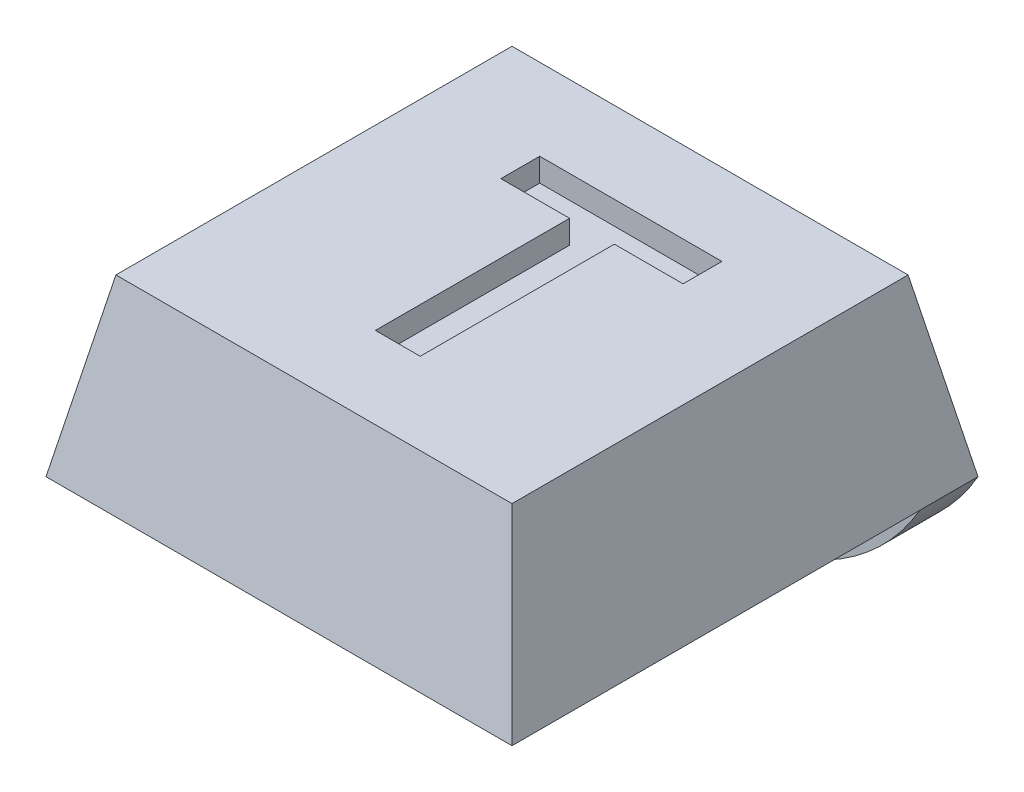
ISO-10303-21;
HEADER;
FILE_DESCRIPTION(('STEP AP214'),'2;1');
FILE_NAME('part.step','',(''),(''),'','','');
FILE_SCHEMA(('AUTOMOTIVE_DESIGN { 1 0 10303 214 1 1 1 1 }'));
ENDSEC;
DATA;
#1=APPLICATION_CONTEXT('core data for automotive mechanical design processes');
#2=APPLICATION_PROTOCOL_DEFINITION('international standard','automotive_design',2000,#1);
#3=PRODUCT_CONTEXT('',#1,'mechanical');
#4=PRODUCT('Part','Part','',(#3));
#5=PRODUCT_RELATED_PRODUCT_CATEGORY('part','',(#4));
#6=PRODUCT_DEFINITION_FORMATION('','',#4);
#7=PRODUCT_DEFINITION_CONTEXT('part definition',#1,'design');
#8=PRODUCT_DEFINITION('design','',#6,#7);
#9=PRODUCT_DEFINITION_SHAPE('','',#8);
#10=(LENGTH_UNIT() NAMED_UNIT(*) SI_UNIT(.MILLI.,.METRE.));
#11=(NAMED_UNIT(*) PLANE_ANGLE_UNIT() SI_UNIT($,.RADIAN.));
#12=(NAMED_UNIT(*) SI_UNIT($,.STERADIAN.) SOLID_ANGLE_UNIT());
#13=UNCERTAINTY_MEASURE_WITH_UNIT(LENGTH_MEASURE(1.E-05),#10,'distance_accuracy_value','');
#14=(GEOMETRIC_REPRESENTATION_CONTEXT(3) GLOBAL_UNCERTAINTY_ASSIGNED_CONTEXT((#13)) GLOBAL_UNIT_ASSIGNED_CONTEXT((#10,
#11,#12)) REPRESENTATION_CONTEXT('',''));
#15=CARTESIAN_POINT('',(0.,0.,0.));
#16=DIRECTION('',(0.,0.,1.));
#17=DIRECTION('',(1.,0.,0.));
#18=AXIS2_PLACEMENT_3D('',#15,#16,#17);
#19=CARTESIAN_POINT('',(0.,3.,0.));
#20=DIRECTION('',(0.,-1.,0.));
#21=DIRECTION('',(0.,0.,-1.));
#22=AXIS2_PLACEMENT_3D('',#19,#20,#21);
#23=PLANE('',#22);
#24=DIRECTION('',(-1.,0.,0.));
#25=VECTOR('',#24,1.);
#26=CARTESIAN_POINT('',(11.,3.,-0.6));
#27=LINE('',#26,#25);
#28=CARTESIAN_POINT('',(7.4,3.,-0.6));
#29=VERTEX_POINT('',#28);
#30=CARTESIAN_POINT('',(0.6,3.,-0.6));
#31=VERTEX_POINT('',#30);
#32=EDGE_CURVE('E205',#29,#31,#27,.T.);
#33=ORIENTED_EDGE('',*,*,#32,.F.);
#34=DIRECTION('',(0.,0.,1.));
#35=VECTOR('',#34,1.);
#36=CARTESIAN_POINT('',(7.4,3.,-8.));
#37=LINE('',#36,#35);
#38=CARTESIAN_POINT('',(7.4,3.,-7.4));
#39=VERTEX_POINT('',#38);
#40=EDGE_CURVE('E218',#39,#29,#37,.T.);
#41=ORIENTED_EDGE('',*,*,#40,.F.);
#42=DIRECTION('',(-1.,0.,0.));
#43=VECTOR('',#42,1.);
#44=CARTESIAN_POINT('',(11.,3.,-7.4));
#45=LINE('',#44,#43);
#46=CARTESIAN_POINT('',(0.599999999999999,3.,-7.4));
#47=VERTEX_POINT('',#46);
#48=EDGE_CURVE('E201',#39,#47,#45,.T.);
#49=ORIENTED_EDGE('',*,*,#48,.T.);
#50=DIRECTION('',(0.,0.,1.));
#51=VECTOR('',#50,1.);
#52=CARTESIAN_POINT('',(0.6,3.,-8.));
#53=LINE('',#52,#51);
#54=EDGE_CURVE('E221',#47,#31,#53,.T.);
#55=ORIENTED_EDGE('',*,*,#54,.T.);
#56=EDGE_LOOP('',(#33,#41,#49,#55));
#57=FACE_BOUND('',#56,.T.);
#58=DIRECTION('',(-1.,0.,0.));
#59=VECTOR('',#58,1.);
#60=CARTESIAN_POINT('',(4.42159375367961,3.,-2.00285635155468));
#61=LINE('',#60,#59);
#62=CARTESIAN_POINT('',(4.42159375367961,3.,-2.00285635155468));
#63=VERTEX_POINT('',#62);
#64=CARTESIAN_POINT('',(3.65236298444884,3.,-2.00285635155468));
#65=VERTEX_POINT('',#64);
#66=EDGE_CURVE('E58',#63,#65,#61,.T.);
#67=ORIENTED_EDGE('',*,*,#66,.T.);
#68=DIRECTION('',(0.,0.,-1.));
#69=VECTOR('',#68,1.);
#70=CARTESIAN_POINT('',(3.65236298444884,3.,-2.00285635155468));
#71=LINE('',#70,#69);
#72=CARTESIAN_POINT('',(3.65236298444884,3.,-5.33618968488802));
#73=VERTEX_POINT('',#72);
#74=EDGE_CURVE('E173',#65,#73,#71,.T.);
#75=ORIENTED_EDGE('',*,*,#74,.T.);
#76=DIRECTION('',(-1.,0.,0.));
#77=VECTOR('',#76,1.);
#78=CARTESIAN_POINT('',(3.65236298444884,3.,-5.33618968488802));
#79=LINE('',#78,#77);
#80=CARTESIAN_POINT('',(2.47287580496166,3.,-5.33618968488802));
#81=VERTEX_POINT('',#80);
#82=EDGE_CURVE('E582',#73,#81,#79,.T.);
#83=ORIENTED_EDGE('',*,*,#82,.T.);
#84=DIRECTION('',(0.,0.,-1.));
#85=VECTOR('',#84,1.);
#86=CARTESIAN_POINT('',(2.47287580496166,3.,-5.33618968488802));
#87=LINE('',#86,#85);
#88=CARTESIAN_POINT('',(2.47287580496166,3.,-6.00285635155468));
#89=VERTEX_POINT('',#88);
#90=EDGE_CURVE('E584',#81,#89,#87,.T.);
#91=ORIENTED_EDGE('',*,*,#90,.T.);
#92=DIRECTION('',(1.,0.,0.));
#93=VECTOR('',#92,1.);
#94=CARTESIAN_POINT('',(2.47287580496166,3.,-6.00285635155468));
#95=LINE('',#94,#93);
#96=CARTESIAN_POINT('',(5.60108093316679,3.,-6.00285635155468));
#97=VERTEX_POINT('',#96);
#98=EDGE_CURVE('E560',#89,#97,#95,.T.);
#99=ORIENTED_EDGE('',*,*,#98,.T.);
#100=DIRECTION('',(0.,0.,1.));
#101=VECTOR('',#100,1.);
#102=CARTESIAN_POINT('',(5.60108093316679,3.,-6.00285635155468));
#103=LINE('',#102,#101);
#104=CARTESIAN_POINT('',(5.60108093316679,3.,-5.33618968488802));
#105=VERTEX_POINT('',#104);
#106=EDGE_CURVE('E555',#97,#105,#103,.T.);
#107=ORIENTED_EDGE('',*,*,#106,.T.);
#108=DIRECTION('',(-1.,0.,0.));
#109=VECTOR('',#108,1.);
#110=CARTESIAN_POINT('',(5.60108093316679,3.,-5.33618968488802));
#111=LINE('',#110,#109);
#112=CARTESIAN_POINT('',(4.42159375367961,3.,-5.33618968488802));
#113=VERTEX_POINT('',#112);
#114=EDGE_CURVE('E549',#105,#113,#111,.T.);
#115=ORIENTED_EDGE('',*,*,#114,.T.);
#116=DIRECTION('',(0.,0.,1.));
#117=VECTOR('',#116,1.);
#118=CARTESIAN_POINT('',(4.42159375367961,3.,-5.33618968488802));
#119=LINE('',#118,#117);
#120=EDGE_CURVE('E169',#113,#63,#119,.T.);
#121=ORIENTED_EDGE('',*,*,#120,.T.);
#122=EDGE_LOOP('',(#67,#75,#83,#91,#99,#107,#115,#121));
#123=FACE_BOUND('',#122,.T.);
#124=ADVANCED_FACE('F42',(#57,#123),#23,.F.);
#125=CARTESIAN_POINT('',(8.,0.,-8.));
#126=DIRECTION('',(-0.98058067569092,-0.196116135138184,0.));
#127=DIRECTION('',(0.196116135138184,-0.98058067569092,0.));
#128=AXIS2_PLACEMENT_3D('',#125,#126,#127);
#129=PLANE('',#128);
#130=DIRECTION('',(-0.192450089729875,0.962250448649376,-0.192450089729875));
#131=VECTOR('',#130,1.);
#132=CARTESIAN_POINT('',(7.7037037037037,1.48148148148148,-0.296296296296296));
#133=LINE('',#132,#131);
#134=CARTESIAN_POINT('',(8.,0.,0.));
#135=VERTEX_POINT('',#134);
#136=EDGE_CURVE('E215',#135,#29,#133,.T.);
#137=ORIENTED_EDGE('',*,*,#136,.F.);
#138=DIRECTION('',(0.,0.,-1.));
#139=VECTOR('',#138,1.);
#140=CARTESIAN_POINT('',(8.,0.,0.));
#141=LINE('',#140,#139);
#142=CARTESIAN_POINT('',(8.,0.,-7.));
#143=VERTEX_POINT('',#142);
#144=EDGE_CURVE('E234',#135,#143,#141,.T.);
#145=ORIENTED_EDGE('',*,*,#144,.T.);
#146=DIRECTION('',(0.,0.,1.));
#147=VECTOR('',#146,1.);
#148=CARTESIAN_POINT('',(8.,0.,-8.));
#149=LINE('',#148,#147);
#150=CARTESIAN_POINT('',(8.,0.,-8.));
#151=VERTEX_POINT('',#150);
#152=EDGE_CURVE('E175',#151,#143,#149,.T.);
#153=ORIENTED_EDGE('',*,*,#152,.F.);
#154=DIRECTION('',(0.192450089729875,-0.962250448649376,-0.192450089729875));
#155=VECTOR('',#154,1.);
#156=CARTESIAN_POINT('',(8.,0.,-8.));
#157=LINE('',#156,#155);
#158=EDGE_CURVE('E208',#39,#151,#157,.T.);
#159=ORIENTED_EDGE('',*,*,#158,.F.);
#160=ORIENTED_EDGE('',*,*,#40,.T.);
#161=EDGE_LOOP('',(#137,#145,#153,#159,#160));
#162=FACE_BOUND('',#161,.T.);
#163=ADVANCED_FACE('F302',(#162),#129,.F.);
#164=CARTESIAN_POINT('',(0.,0.,-8.));
#165=DIRECTION('',(0.98058067569092,-0.196116135138184,0.));
#166=DIRECTION('',(0.196116135138184,0.98058067569092,0.));
#167=AXIS2_PLACEMENT_3D('',#164,#165,#166);
#168=PLANE('',#167);
#169=DIRECTION('',(-0.192450089729875,-0.962250448649376,0.192450089729875));
#170=VECTOR('',#169,1.);
#171=CARTESIAN_POINT('',(0.296296296296296,1.48148148148148,-0.296296296296296));
#172=LINE('',#171,#170);
#173=CARTESIAN_POINT('',(0.,0.,0.));
#174=VERTEX_POINT('',#173);
#175=EDGE_CURVE('E262',#31,#174,#172,.T.);
#176=ORIENTED_EDGE('',*,*,#175,.F.);
#177=ORIENTED_EDGE('',*,*,#54,.F.);
#178=DIRECTION('',(0.192450089729875,0.962250448649376,0.192450089729875));
#179=VECTOR('',#178,1.);
#180=CARTESIAN_POINT('',(0.,0.,-8.));
#181=LINE('',#180,#179);
#182=CARTESIAN_POINT('',(0.,0.,-8.));
#183=VERTEX_POINT('',#182);
#184=EDGE_CURVE('E233',#183,#47,#181,.T.);
#185=ORIENTED_EDGE('',*,*,#184,.F.);
#186=DIRECTION('',(0.,0.,1.));
#187=VECTOR('',#186,1.);
#188=CARTESIAN_POINT('',(0.,0.,0.));
#189=LINE('',#188,#187);
#190=CARTESIAN_POINT('',(0.,0.,-7.));
#191=VERTEX_POINT('',#190);
#192=EDGE_CURVE('E238',#183,#191,#189,.T.);
#193=ORIENTED_EDGE('',*,*,#192,.T.);
#194=EDGE_CURVE('E225',#191,#174,#189,.T.);
#195=ORIENTED_EDGE('',*,*,#194,.T.);
#196=EDGE_LOOP('',(#176,#177,#185,#193,#195));
#197=FACE_BOUND('',#196,.T.);
#198=ADVANCED_FACE('F286',(#197),#168,.F.);
#199=CARTESIAN_POINT('',(0.,0.,0.));
#200=DIRECTION('',(0.,-1.,0.));
#201=DIRECTION('',(0.,0.,-1.));
#202=AXIS2_PLACEMENT_3D('',#199,#200,#201);
#203=PLANE('',#202);
#204=DIRECTION('',(-1.,0.,0.));
#205=VECTOR('',#204,1.);
#206=CARTESIAN_POINT('',(0.,0.,-7.));
#207=LINE('',#206,#205);
#208=EDGE_CURVE('E181',#143,#191,#207,.T.);
#209=ORIENTED_EDGE('',*,*,#208,.F.);
#210=ORIENTED_EDGE('',*,*,#144,.F.);
#211=DIRECTION('',(1.,0.,0.));
#212=VECTOR('',#211,1.);
#213=CARTESIAN_POINT('',(0.,0.,0.));
#214=LINE('',#213,#212);
#215=EDGE_CURVE('E235',#174,#135,#214,.T.);
#216=ORIENTED_EDGE('',*,*,#215,.F.);
#217=ORIENTED_EDGE('',*,*,#194,.F.);
#218=EDGE_LOOP('',(#209,#210,#216,#217));
#219=FACE_BOUND('',#218,.T.);
#220=CARTESIAN_POINT('',(4.,0.,-3.75));
#221=DIRECTION('',(0.,-1.,0.));
#222=DIRECTION('',(0.,0.,-1.));
#223=AXIS2_PLACEMENT_3D('',#220,#221,#222);
#224=CIRCLE('',#223,1.8);
#225=CARTESIAN_POINT('',(4.,0.,-5.55));
#226=VERTEX_POINT('',#225);
#227=EDGE_CURVE('E193',#226,#226,#224,.T.);
#228=ORIENTED_EDGE('',*,*,#227,.F.);
#229=EDGE_LOOP('',(#228));
#230=FACE_BOUND('',#229,.T.);
#231=ADVANCED_FACE('F297',(#219,#230),#203,.T.);
#232=CARTESIAN_POINT('',(11.,3.,-7.4));
#233=DIRECTION('',(0.,0.196116135138184,-0.98058067569092));
#234=DIRECTION('',(0.,0.98058067569092,0.196116135138184));
#235=AXIS2_PLACEMENT_3D('',#232,#233,#234);
#236=PLANE('',#235);
#237=ORIENTED_EDGE('',*,*,#158,.T.);
#238=DIRECTION('',(-1.,0.,0.));
#239=VECTOR('',#238,1.);
#240=CARTESIAN_POINT('',(0.,0.,-8.));
#241=LINE('',#240,#239);
#242=EDGE_CURVE('E229',#151,#183,#241,.T.);
#243=ORIENTED_EDGE('',*,*,#242,.T.);
#244=ORIENTED_EDGE('',*,*,#184,.T.);
#245=ORIENTED_EDGE('',*,*,#48,.F.);
#246=EDGE_LOOP('',(#237,#243,#244,#245));
#247=FACE_BOUND('',#246,.T.);
#248=ADVANCED_FACE('F281',(#247),#236,.T.);
#249=CARTESIAN_POINT('',(11.,0.,0.));
#250=DIRECTION('',(0.,0.196116135138184,0.98058067569092));
#251=DIRECTION('',(0.,-0.98058067569092,0.196116135138184));
#252=AXIS2_PLACEMENT_3D('',#249,#250,#251);
#253=PLANE('',#252);
#254=ORIENTED_EDGE('',*,*,#136,.T.);
#255=ORIENTED_EDGE('',*,*,#32,.T.);
#256=ORIENTED_EDGE('',*,*,#175,.T.);
#257=ORIENTED_EDGE('',*,*,#215,.T.);
#258=EDGE_LOOP('',(#254,#255,#256,#257));
#259=FACE_BOUND('',#258,.T.);
#260=ADVANCED_FACE('F328',(#259),#253,.T.);
#261=CARTESIAN_POINT('',(4.,0.8,-3.75));
#262=DIRECTION('',(0.,-1.,0.));
#263=DIRECTION('',(0.,0.,-1.));
#264=AXIS2_PLACEMENT_3D('',#261,#262,#263);
#265=CYLINDRICAL_SURFACE('',#264,1.8);
#266=CARTESIAN_POINT('',(4.,0.8,-3.75));
#267=DIRECTION('',(0.,-1.,0.));
#268=DIRECTION('',(0.,0.,-1.));
#269=AXIS2_PLACEMENT_3D('',#266,#267,#268);
#270=CIRCLE('',#269,1.8);
#271=CARTESIAN_POINT('',(4.,0.8,-5.55));
#272=VERTEX_POINT('',#271);
#273=EDGE_CURVE('E197',#272,#272,#270,.T.);
#274=ORIENTED_EDGE('',*,*,#273,.F.);
#275=EDGE_LOOP('',(#274));
#276=FACE_BOUND('',#275,.T.);
#277=ORIENTED_EDGE('',*,*,#227,.T.);
#278=EDGE_LOOP('',(#277));
#279=FACE_BOUND('',#278,.T.);
#280=ADVANCED_FACE('F335',(#276,#279),#265,.F.);
#281=CARTESIAN_POINT('',(4.,0.8,-3.75));
#282=DIRECTION('',(0.,-1.,0.));
#283=DIRECTION('',(0.,0.,-1.));
#284=AXIS2_PLACEMENT_3D('',#281,#282,#283);
#285=PLANE('',#284);
#286=ORIENTED_EDGE('',*,*,#273,.T.);
#287=EDGE_LOOP('',(#286));
#288=FACE_BOUND('',#287,.T.);
#289=ADVANCED_FACE('F339',(#288),#285,.T.);
#290=CARTESIAN_POINT('',(0.,-2.,-8.));
#291=DIRECTION('',(0.,0.,1.));
#292=DIRECTION('',(1.,0.,0.));
#293=AXIS2_PLACEMENT_3D('',#290,#291,#292);
#294=PLANE('',#293);
#295=ORIENTED_EDGE('',*,*,#242,.F.);
#296=CARTESIAN_POINT('',(4.53589838486225,2.,-8.));
#297=DIRECTION('',(0.,0.,1.));
#298=DIRECTION('',(1.,0.,0.));
#299=AXIS2_PLACEMENT_3D('',#296,#297,#298);
#300=CIRCLE('',#299,4.);
#301=CARTESIAN_POINT('',(4.53589838486225,-2.,-8.));
#302=VERTEX_POINT('',#301);
#303=EDGE_CURVE('E11',#151,#302,#300,.F.);
#304=ORIENTED_EDGE('',*,*,#303,.T.);
#305=DIRECTION('',(1.,0.,0.));
#306=VECTOR('',#305,1.);
#307=CARTESIAN_POINT('',(0.,-2.,-8.));
#308=LINE('',#307,#306);
#309=CARTESIAN_POINT('',(3.46410161513775,-2.,-8.));
#310=VERTEX_POINT('',#309);
#311=EDGE_CURVE('E187',#310,#302,#308,.T.);
#312=ORIENTED_EDGE('',*,*,#311,.F.);
#313=CARTESIAN_POINT('',(3.46410161513775,2.,-8.));
#314=DIRECTION('',(0.,0.,1.));
#315=DIRECTION('',(1.,0.,0.));
#316=AXIS2_PLACEMENT_3D('',#313,#314,#315);
#317=CIRCLE('',#316,4.);
#318=EDGE_CURVE('E51',#310,#183,#317,.F.);
#319=ORIENTED_EDGE('',*,*,#318,.T.);
#320=EDGE_LOOP('',(#295,#304,#312,#319));
#321=FACE_BOUND('',#320,.T.);
#322=ADVANCED_FACE('F274',(#321),#294,.F.);
#323=CARTESIAN_POINT('',(0.,-2.,-7.));
#324=DIRECTION('',(0.,0.,-1.));
#325=DIRECTION('',(-1.,0.,0.));
#326=AXIS2_PLACEMENT_3D('',#323,#324,#325);
#327=PLANE('',#326);
#328=DIRECTION('',(-1.,0.,0.));
#329=VECTOR('',#328,1.);
#330=CARTESIAN_POINT('',(0.,-2.,-7.));
#331=LINE('',#330,#329);
#332=CARTESIAN_POINT('',(4.53589838486225,-2.,-7.));
#333=VERTEX_POINT('',#332);
#334=CARTESIAN_POINT('',(3.46410161513775,-2.,-7.));
#335=VERTEX_POINT('',#334);
#336=EDGE_CURVE('E191',#333,#335,#331,.T.);
#337=ORIENTED_EDGE('',*,*,#336,.F.);
#338=CARTESIAN_POINT('',(4.53589838486225,2.,-7.));
#339=DIRECTION('',(0.,0.,-1.));
#340=DIRECTION('',(-1.,0.,0.));
#341=AXIS2_PLACEMENT_3D('',#338,#339,#340);
#342=CIRCLE('',#341,4.);
#343=EDGE_CURVE('E268',#333,#143,#342,.F.);
#344=ORIENTED_EDGE('',*,*,#343,.T.);
#345=ORIENTED_EDGE('',*,*,#208,.T.);
#346=CARTESIAN_POINT('',(3.46410161513775,2.,-7.));
#347=DIRECTION('',(0.,0.,-1.));
#348=DIRECTION('',(-1.,0.,0.));
#349=AXIS2_PLACEMENT_3D('',#346,#347,#348);
#350=CIRCLE('',#349,4.);
#351=EDGE_CURVE('E66',#191,#335,#350,.F.);
#352=ORIENTED_EDGE('',*,*,#351,.T.);
#353=EDGE_LOOP('',(#337,#344,#345,#352));
#354=FACE_BOUND('',#353,.T.);
#355=ADVANCED_FACE('F292',(#354),#327,.F.);
#356=CARTESIAN_POINT('',(0.,-2.,0.));
#357=DIRECTION('',(0.,1.,0.));
#358=DIRECTION('',(0.,0.,1.));
#359=AXIS2_PLACEMENT_3D('',#356,#357,#358);
#360=PLANE('',#359);
#361=ORIENTED_EDGE('',*,*,#311,.T.);
#362=DIRECTION('',(0.,0.,1.));
#363=VECTOR('',#362,1.);
#364=CARTESIAN_POINT('',(4.53589838486225,-2.,0.));
#365=LINE('',#364,#363);
#366=EDGE_CURVE('E261',#302,#333,#365,.T.);
#367=ORIENTED_EDGE('',*,*,#366,.T.);
#368=ORIENTED_EDGE('',*,*,#336,.T.);
#369=DIRECTION('',(0.,0.,-1.));
#370=VECTOR('',#369,1.);
#371=CARTESIAN_POINT('',(3.46410161513775,-2.,0.));
#372=LINE('',#371,#370);
#373=EDGE_CURVE('E257',#335,#310,#372,.T.);
#374=ORIENTED_EDGE('',*,*,#373,.T.);
#375=EDGE_LOOP('',(#361,#367,#368,#374));
#376=FACE_BOUND('',#375,.T.);
#377=ADVANCED_FACE('F290',(#376),#360,.F.);
#378=CARTESIAN_POINT('',(4.53589838486225,2.,-8.));
#379=DIRECTION('',(0.,0.,1.));
#380=DIRECTION('',(1.,0.,0.));
#381=AXIS2_PLACEMENT_3D('',#378,#379,#380);
#382=CYLINDRICAL_SURFACE('',#381,4.);
#383=ORIENTED_EDGE('',*,*,#303,.F.);
#384=ORIENTED_EDGE('',*,*,#152,.T.);
#385=ORIENTED_EDGE('',*,*,#343,.F.);
#386=ORIENTED_EDGE('',*,*,#366,.F.);
#387=EDGE_LOOP('',(#383,#384,#385,#386));
#388=FACE_BOUND('',#387,.T.);
#389=ADVANCED_FACE('F303',(#388),#382,.T.);
#390=CARTESIAN_POINT('',(3.46410161513775,2.,-8.));
#391=DIRECTION('',(0.,0.,-1.));
#392=DIRECTION('',(-1.,0.,0.));
#393=AXIS2_PLACEMENT_3D('',#390,#391,#392);
#394=CYLINDRICAL_SURFACE('',#393,4.);
#395=ORIENTED_EDGE('',*,*,#351,.F.);
#396=ORIENTED_EDGE('',*,*,#192,.F.);
#397=ORIENTED_EDGE('',*,*,#318,.F.);
#398=ORIENTED_EDGE('',*,*,#373,.F.);
#399=EDGE_LOOP('',(#395,#396,#397,#398));
#400=FACE_BOUND('',#399,.T.);
#401=ADVANCED_FACE('F44',(#400),#394,.T.);
#402=CARTESIAN_POINT('',(4.42159375367961,2.6,-2.00285635155468));
#403=DIRECTION('',(0.,0.,-1.));
#404=DIRECTION('',(-1.,0.,0.));
#405=AXIS2_PLACEMENT_3D('',#402,#403,#404);
#406=PLANE('',#405);
#407=ORIENTED_EDGE('',*,*,#66,.F.);
#408=DIRECTION('',(0.,1.,0.));
#409=VECTOR('',#408,1.);
#410=CARTESIAN_POINT('',(4.42159375367961,2.6,-2.00285635155468));
#411=LINE('',#410,#409);
#412=CARTESIAN_POINT('',(4.42159375367961,2.6,-2.00285635155468));
#413=VERTEX_POINT('',#412);
#414=EDGE_CURVE('E167',#413,#63,#411,.T.);
#415=ORIENTED_EDGE('',*,*,#414,.F.);
#416=DIRECTION('',(-1.,0.,0.));
#417=VECTOR('',#416,1.);
#418=CARTESIAN_POINT('',(4.42159375367961,2.6,-2.00285635155468));
#419=LINE('',#418,#417);
#420=CARTESIAN_POINT('',(3.65236298444884,2.6,-2.00285635155468));
#421=VERTEX_POINT('',#420);
#422=EDGE_CURVE('E157',#413,#421,#419,.T.);
#423=ORIENTED_EDGE('',*,*,#422,.T.);
#424=DIRECTION('',(0.,1.,0.));
#425=VECTOR('',#424,1.);
#426=CARTESIAN_POINT('',(3.65236298444884,2.6,-2.00285635155468));
#427=LINE('',#426,#425);
#428=EDGE_CURVE('E166',#421,#65,#427,.T.);
#429=ORIENTED_EDGE('',*,*,#428,.T.);
#430=EDGE_LOOP('',(#407,#415,#423,#429));
#431=FACE_BOUND('',#430,.T.);
#432=ADVANCED_FACE('F165',(#431),#406,.T.);
#433=CARTESIAN_POINT('',(3.65236298444884,2.6,-2.00285635155468));
#434=DIRECTION('',(1.,0.,0.));
#435=DIRECTION('',(0.,0.,-1.));
#436=AXIS2_PLACEMENT_3D('',#433,#434,#435);
#437=PLANE('',#436);
#438=ORIENTED_EDGE('',*,*,#74,.F.);
#439=ORIENTED_EDGE('',*,*,#428,.F.);
#440=DIRECTION('',(0.,0.,-1.));
#441=VECTOR('',#440,1.);
#442=CARTESIAN_POINT('',(3.65236298444884,2.6,-2.00285635155468));
#443=LINE('',#442,#441);
#444=CARTESIAN_POINT('',(3.65236298444884,2.6,-5.33618968488802));
#445=VERTEX_POINT('',#444);
#446=EDGE_CURVE('E153',#421,#445,#443,.T.);
#447=ORIENTED_EDGE('',*,*,#446,.T.);
#448=DIRECTION('',(0.,1.,0.));
#449=VECTOR('',#448,1.);
#450=CARTESIAN_POINT('',(3.65236298444884,2.6,-5.33618968488802));
#451=LINE('',#450,#449);
#452=EDGE_CURVE('E176',#445,#73,#451,.T.);
#453=ORIENTED_EDGE('',*,*,#452,.T.);
#454=EDGE_LOOP('',(#438,#439,#447,#453));
#455=FACE_BOUND('',#454,.T.);
#456=ADVANCED_FACE('F171',(#455),#437,.T.);
#457=CARTESIAN_POINT('',(3.65236298444884,2.6,-5.33618968488802));
#458=DIRECTION('',(0.,0.,-1.));
#459=DIRECTION('',(-1.,0.,0.));
#460=AXIS2_PLACEMENT_3D('',#457,#458,#459);
#461=PLANE('',#460);
#462=ORIENTED_EDGE('',*,*,#82,.F.);
#463=ORIENTED_EDGE('',*,*,#452,.F.);
#464=DIRECTION('',(-1.,0.,0.));
#465=VECTOR('',#464,1.);
#466=CARTESIAN_POINT('',(3.65236298444884,2.6,-5.33618968488802));
#467=LINE('',#466,#465);
#468=CARTESIAN_POINT('',(2.47287580496166,2.6,-5.33618968488802));
#469=VERTEX_POINT('',#468);
#470=EDGE_CURVE('E159',#445,#469,#467,.T.);
#471=ORIENTED_EDGE('',*,*,#470,.T.);
#472=DIRECTION('',(0.,1.,0.));
#473=VECTOR('',#472,1.);
#474=CARTESIAN_POINT('',(2.47287580496166,2.6,-5.33618968488802));
#475=LINE('',#474,#473);
#476=EDGE_CURVE('E183',#469,#81,#475,.T.);
#477=ORIENTED_EDGE('',*,*,#476,.T.);
#478=EDGE_LOOP('',(#462,#463,#471,#477));
#479=FACE_BOUND('',#478,.T.);
#480=ADVANCED_FACE('F352',(#479),#461,.T.);
#481=CARTESIAN_POINT('',(2.47287580496166,2.6,-5.33618968488802));
#482=DIRECTION('',(1.,0.,0.));
#483=DIRECTION('',(0.,0.,-1.));
#484=AXIS2_PLACEMENT_3D('',#481,#482,#483);
#485=PLANE('',#484);
#486=ORIENTED_EDGE('',*,*,#90,.F.);
#487=ORIENTED_EDGE('',*,*,#476,.F.);
#488=DIRECTION('',(0.,0.,-1.));
#489=VECTOR('',#488,1.);
#490=CARTESIAN_POINT('',(2.47287580496166,2.6,-5.33618968488802));
#491=LINE('',#490,#489);
#492=CARTESIAN_POINT('',(2.47287580496166,2.6,-6.00285635155468));
#493=VERTEX_POINT('',#492);
#494=EDGE_CURVE('E612',#469,#493,#491,.T.);
#495=ORIENTED_EDGE('',*,*,#494,.T.);
#496=DIRECTION('',(0.,1.,0.));
#497=VECTOR('',#496,1.);
#498=CARTESIAN_POINT('',(2.47287580496166,2.6,-6.00285635155468));
#499=LINE('',#498,#497);
#500=EDGE_CURVE('E575',#493,#89,#499,.T.);
#501=ORIENTED_EDGE('',*,*,#500,.T.);
#502=EDGE_LOOP('',(#486,#487,#495,#501));
#503=FACE_BOUND('',#502,.T.);
#504=ADVANCED_FACE('F355',(#503),#485,.T.);
#505=CARTESIAN_POINT('',(2.47287580496166,2.6,-6.00285635155468));
#506=DIRECTION('',(0.,0.,1.));
#507=DIRECTION('',(1.,0.,0.));
#508=AXIS2_PLACEMENT_3D('',#505,#506,#507);
#509=PLANE('',#508);
#510=ORIENTED_EDGE('',*,*,#98,.F.);
#511=ORIENTED_EDGE('',*,*,#500,.F.);
#512=DIRECTION('',(1.,0.,0.));
#513=VECTOR('',#512,1.);
#514=CARTESIAN_POINT('',(2.47287580496166,2.6,-6.00285635155468));
#515=LINE('',#514,#513);
#516=CARTESIAN_POINT('',(5.60108093316679,2.6,-6.00285635155468));
#517=VERTEX_POINT('',#516);
#518=EDGE_CURVE('E597',#493,#517,#515,.T.);
#519=ORIENTED_EDGE('',*,*,#518,.T.);
#520=DIRECTION('',(0.,1.,0.));
#521=VECTOR('',#520,1.);
#522=CARTESIAN_POINT('',(5.60108093316679,2.6,-6.00285635155468));
#523=LINE('',#522,#521);
#524=EDGE_CURVE('E572',#517,#97,#523,.T.);
#525=ORIENTED_EDGE('',*,*,#524,.T.);
#526=EDGE_LOOP('',(#510,#511,#519,#525));
#527=FACE_BOUND('',#526,.T.);
#528=ADVANCED_FACE('F359',(#527),#509,.T.);
#529=CARTESIAN_POINT('',(5.60108093316679,2.6,-6.00285635155468));
#530=DIRECTION('',(-1.,0.,0.));
#531=DIRECTION('',(0.,0.,1.));
#532=AXIS2_PLACEMENT_3D('',#529,#530,#531);
#533=PLANE('',#532);
#534=ORIENTED_EDGE('',*,*,#106,.F.);
#535=ORIENTED_EDGE('',*,*,#524,.F.);
#536=DIRECTION('',(0.,0.,1.));
#537=VECTOR('',#536,1.);
#538=CARTESIAN_POINT('',(5.60108093316679,2.6,-6.00285635155468));
#539=LINE('',#538,#537);
#540=CARTESIAN_POINT('',(5.60108093316679,2.6,-5.33618968488802));
#541=VERTEX_POINT('',#540);
#542=EDGE_CURVE('E599',#517,#541,#539,.T.);
#543=ORIENTED_EDGE('',*,*,#542,.T.);
#544=DIRECTION('',(0.,1.,0.));
#545=VECTOR('',#544,1.);
#546=CARTESIAN_POINT('',(5.60108093316679,2.6,-5.33618968488802));
#547=LINE('',#546,#545);
#548=EDGE_CURVE('E569',#541,#105,#547,.T.);
#549=ORIENTED_EDGE('',*,*,#548,.T.);
#550=EDGE_LOOP('',(#534,#535,#543,#549));
#551=FACE_BOUND('',#550,.T.);
#552=ADVANCED_FACE('F363',(#551),#533,.T.);
#553=CARTESIAN_POINT('',(5.60108093316679,2.6,-5.33618968488802));
#554=DIRECTION('',(0.,0.,-1.));
#555=DIRECTION('',(-1.,0.,0.));
#556=AXIS2_PLACEMENT_3D('',#553,#554,#555);
#557=PLANE('',#556);
#558=ORIENTED_EDGE('',*,*,#114,.F.);
#559=ORIENTED_EDGE('',*,*,#548,.F.);
#560=DIRECTION('',(-1.,0.,0.));
#561=VECTOR('',#560,1.);
#562=CARTESIAN_POINT('',(5.60108093316679,2.6,-5.33618968488802));
#563=LINE('',#562,#561);
#564=CARTESIAN_POINT('',(4.42159375367961,2.6,-5.33618968488802));
#565=VERTEX_POINT('',#564);
#566=EDGE_CURVE('E601',#541,#565,#563,.T.);
#567=ORIENTED_EDGE('',*,*,#566,.T.);
#568=DIRECTION('',(0.,1.,0.));
#569=VECTOR('',#568,1.);
#570=CARTESIAN_POINT('',(4.42159375367961,2.6,-5.33618968488802));
#571=LINE('',#570,#569);
#572=EDGE_CURVE('E547',#565,#113,#571,.T.);
#573=ORIENTED_EDGE('',*,*,#572,.T.);
#574=EDGE_LOOP('',(#558,#559,#567,#573));
#575=FACE_BOUND('',#574,.T.);
#576=ADVANCED_FACE('F367',(#575),#557,.T.);
#577=CARTESIAN_POINT('',(4.42159375367961,2.6,-5.33618968488802));
#578=DIRECTION('',(-1.,0.,0.));
#579=DIRECTION('',(0.,0.,1.));
#580=AXIS2_PLACEMENT_3D('',#577,#578,#579);
#581=PLANE('',#580);
#582=ORIENTED_EDGE('',*,*,#120,.F.);
#583=ORIENTED_EDGE('',*,*,#572,.F.);
#584=DIRECTION('',(0.,0.,1.));
#585=VECTOR('',#584,1.);
#586=CARTESIAN_POINT('',(4.42159375367961,2.6,-5.33618968488802));
#587=LINE('',#586,#585);
#588=EDGE_CURVE('E566',#565,#413,#587,.T.);
#589=ORIENTED_EDGE('',*,*,#588,.T.);
#590=ORIENTED_EDGE('',*,*,#414,.T.);
#591=EDGE_LOOP('',(#582,#583,#589,#590));
#592=FACE_BOUND('',#591,.T.);
#593=ADVANCED_FACE('F371',(#592),#581,.T.);
#594=CARTESIAN_POINT('',(0.,2.6,0.));
#595=DIRECTION('',(0.,-1.,0.));
#596=DIRECTION('',(0.,0.,-1.));
#597=AXIS2_PLACEMENT_3D('',#594,#595,#596);
#598=PLANE('',#597);
#599=ORIENTED_EDGE('',*,*,#422,.F.);
#600=ORIENTED_EDGE('',*,*,#588,.F.);
#601=ORIENTED_EDGE('',*,*,#566,.F.);
#602=ORIENTED_EDGE('',*,*,#542,.F.);
#603=ORIENTED_EDGE('',*,*,#518,.F.);
#604=ORIENTED_EDGE('',*,*,#494,.F.);
#605=ORIENTED_EDGE('',*,*,#470,.F.);
#606=ORIENTED_EDGE('',*,*,#446,.F.);
#607=EDGE_LOOP('',(#599,#600,#601,#602,#603,#604,#605,#606));
#608=FACE_BOUND('',#607,.T.);
#609=ADVANCED_FACE('F155',(#608),#598,.F.);
#610=CLOSED_SHELL('',(#124,#163,#198,#231,#248,#260,#280,#289,#322,#355,#377,#389,#401,#432,
#456,#480,#504,#528,#552,#576,#593,#609));
#611=MANIFOLD_SOLID_BREP('B2',#610);
#612=ADVANCED_BREP_SHAPE_REPRESENTATION('',(#18,#611),#14);
#613=SHAPE_DEFINITION_REPRESENTATION(#9,#612);
ENDSEC;
END-ISO-10303-21;
